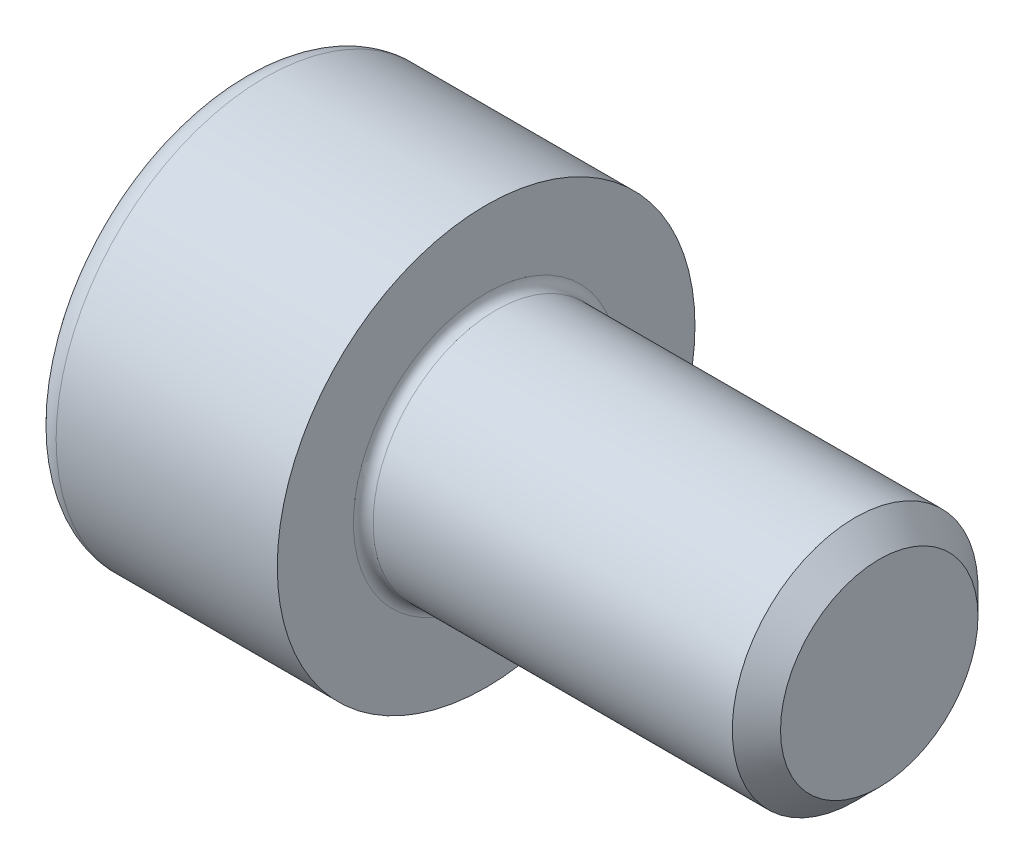
ISO-10303-21;
HEADER;
FILE_DESCRIPTION(('STEP AP214'),'2;1');
FILE_NAME('part.step','',(''),(''),'','','');
FILE_SCHEMA(('AUTOMOTIVE_DESIGN { 1 0 10303 214 1 1 1 1 }'));
ENDSEC;
DATA;
#1=APPLICATION_CONTEXT('core data for automotive mechanical design processes');
#2=APPLICATION_PROTOCOL_DEFINITION('international standard','automotive_design',2000,#1);
#3=PRODUCT_CONTEXT('',#1,'mechanical');
#4=PRODUCT('Part','Part','',(#3));
#5=PRODUCT_RELATED_PRODUCT_CATEGORY('part','',(#4));
#6=PRODUCT_DEFINITION_FORMATION('','',#4);
#7=PRODUCT_DEFINITION_CONTEXT('part definition',#1,'design');
#8=PRODUCT_DEFINITION('design','',#6,#7);
#9=PRODUCT_DEFINITION_SHAPE('','',#8);
#10=(LENGTH_UNIT() NAMED_UNIT(*) SI_UNIT(.MILLI.,.METRE.));
#11=(NAMED_UNIT(*) PLANE_ANGLE_UNIT() SI_UNIT($,.RADIAN.));
#12=(NAMED_UNIT(*) SI_UNIT($,.STERADIAN.) SOLID_ANGLE_UNIT());
#13=UNCERTAINTY_MEASURE_WITH_UNIT(LENGTH_MEASURE(1.E-05),#10,'distance_accuracy_value','');
#14=(GEOMETRIC_REPRESENTATION_CONTEXT(3) GLOBAL_UNCERTAINTY_ASSIGNED_CONTEXT((#13)) GLOBAL_UNIT_ASSIGNED_CONTEXT((#10,
#11,#12)) REPRESENTATION_CONTEXT('',''));
#15=CARTESIAN_POINT('',(0.,0.,0.));
#16=DIRECTION('',(0.,0.,1.));
#17=DIRECTION('',(1.,0.,0.));
#18=AXIS2_PLACEMENT_3D('',#15,#16,#17);
#19=CARTESIAN_POINT('',(8.,1.25,0.));
#20=DIRECTION('',(1.,0.,0.));
#21=DIRECTION('',(0.,1.,0.));
#22=AXIS2_PLACEMENT_3D('',#19,#20,#21);
#23=PLANE('',#22);
#24=CARTESIAN_POINT('',(7.99999999992451,0.,0.));
#25=DIRECTION('',(-1.,0.,0.));
#26=DIRECTION('',(0.,0.,1.));
#27=AXIS2_PLACEMENT_3D('',#24,#25,#26);
#28=CIRCLE('',#27,2.00924000000668);
#29=CARTESIAN_POINT('',(7.99999999992451,2.00924000000668,0.));
#30=VERTEX_POINT('',#29);
#31=EDGE_CURVE('E19',#30,#30,#28,.T.);
#32=ORIENTED_EDGE('',*,*,#31,.F.);
#33=EDGE_LOOP('',(#32));
#34=FACE_BOUND('',#33,.T.);
#35=ADVANCED_FACE('F16',(#34),#23,.T.);
#36=CARTESIAN_POINT('',(7.50923999999031,0.,0.));
#37=DIRECTION('',(-1.,0.,0.));
#38=DIRECTION('',(0.,0.,1.));
#39=AXIS2_PLACEMENT_3D('',#36,#37,#38);
#40=CONICAL_SURFACE('',#39,2.49999999999773,0.785398163455362);
#41=CARTESIAN_POINT('',(7.50924,0.,0.));
#42=DIRECTION('',(1.,0.,0.));
#43=DIRECTION('',(0.,1.,0.));
#44=AXIS2_PLACEMENT_3D('',#41,#42,#43);
#45=CIRCLE('',#44,2.5);
#46=CARTESIAN_POINT('',(7.50923999999516,2.49999999999886,0.));
#47=VERTEX_POINT('',#46);
#48=EDGE_CURVE('E35',#47,#47,#45,.F.);
#49=ORIENTED_EDGE('',*,*,#48,.F.);
#50=EDGE_LOOP('',(#49));
#51=FACE_BOUND('',#50,.T.);
#52=ORIENTED_EDGE('',*,*,#31,.T.);
#53=EDGE_LOOP('',(#52));
#54=FACE_BOUND('',#53,.T.);
#55=ADVANCED_FACE('F183',(#51,#54),#40,.T.);
#56=CARTESIAN_POINT('',(-2.50799999992068,0.,0.));
#57=DIRECTION('',(-1.,0.,0.));
#58=DIRECTION('',(0.,0.,1.));
#59=AXIS2_PLACEMENT_3D('',#56,#57,#58);
#60=CONICAL_SURFACE('',#59,2.32325748316953,1.04719755119795);
#61=CARTESIAN_POINT('',(-1.16666666662013,0.,0.));
#62=VERTEX_POINT('',#61);
#63=VERTEX_LOOP('',#62);
#64=FACE_BOUND('',#63,.T.);
#65=CARTESIAN_POINT('',(-2.4999999999532,2.0000000000117,-1.1547005383725));
#66=CARTESIAN_POINT('',(-2.47069554507963,1.91211211244848,-1.20544263391563));
#67=CARTESIAN_POINT('',(-2.44404467705295,1.82346557789014,-1.25662273450561));
#68=CARTESIAN_POINT('',(-2.39752638735245,1.64463765332491,-1.35986908489197));
#69=CARTESIAN_POINT('',(-2.37767542028997,1.55445308692619,-1.41193716857902));
#70=CARTESIAN_POINT('',(-2.34677595889734,1.37520156625159,-1.51542808229315));
#71=CARTESIAN_POINT('',(-2.33552178754783,1.28616218439386,-1.56683499337719));
#72=CARTESIAN_POINT('',(-2.3220891680807,1.10766467954793,-1.66989057584967));
#73=CARTESIAN_POINT('',(-2.31989959392411,1.01820720490444,-1.72153887291611));
#74=CARTESIAN_POINT('',(-2.32446629010413,0.851065510298021,-1.81803817528993));
#75=CARTESIAN_POINT('',(-2.33010128516551,0.773356209362159,-1.86290366110379));
#76=CARTESIAN_POINT('',(-2.34795730066752,0.61844385823774,-1.95234234872627));
#77=CARTESIAN_POINT('',(-2.36018441471823,0.541241343449726,-1.99691524142125));
#78=CARTESIAN_POINT('',(-2.39074983328857,0.386009858272597,-2.08653818117497));
#79=CARTESIAN_POINT('',(-2.40921764216901,0.308000524611783,-2.13157689096334));
#80=CARTESIAN_POINT('',(-2.45113176079118,0.153145029986886,-2.22098275247052));
#81=CARTESIAN_POINT('',(-2.47456822870469,0.0762968866753003,-2.26535104869819));
#82=CARTESIAN_POINT('',(-2.4999999999532,-1.16991321749545E-11,-2.30940107676526));
#83=B_SPLINE_CURVE_WITH_KNOTS('',3,(#65,#66,#67,#68,#69,#70,#71,#72,#73,#74,#75,#76,#77,#78,#79,
#80,#81,#82),.UNSPECIFIED.,.F.,.F.,(4,2,2,2,2,2,2,2,4),(0.,0.317016011557616,0.63479381702865,
0.944707606155182,1.25424088890079,1.52370778264095,1.79342419380956,2.06912162251021,
2.34427797354285),.UNSPECIFIED.);
#84=CARTESIAN_POINT('',(-2.49999999995125,2.,-1.154700538386));
#85=VERTEX_POINT('',#84);
#86=CARTESIAN_POINT('',(-2.4999999999532,0.,-2.30940107676525));
#87=VERTEX_POINT('',#86);
#88=EDGE_CURVE('E159',#85,#87,#83,.T.);
#89=ORIENTED_EDGE('',*,*,#88,.T.);
#90=CARTESIAN_POINT('',(-2.4999999999532,1.16998034000358E-11,-2.30940107676525));
#91=CARTESIAN_POINT('',(-2.47069554507963,-0.0878878875515161,-2.25865898122212));
#92=CARTESIAN_POINT('',(-2.44404467705295,-0.176534422109856,-2.20747888063214));
#93=CARTESIAN_POINT('',(-2.39752638735245,-0.355362346675091,-2.10423253024578));
#94=CARTESIAN_POINT('',(-2.37767542028997,-0.445546913073804,-2.05216444655873));
#95=CARTESIAN_POINT('',(-2.34677595889734,-0.624798433748409,-1.9486735328446));
#96=CARTESIAN_POINT('',(-2.33552178754783,-0.713837815606133,-1.89726662176056));
#97=CARTESIAN_POINT('',(-2.3220891680807,-0.892335320452072,-1.79421103928809));
#98=CARTESIAN_POINT('',(-2.31989959392411,-0.981792795095561,-1.74256274222164));
#99=CARTESIAN_POINT('',(-2.32446629010413,-1.14893448970198,-1.64606343984782));
#100=CARTESIAN_POINT('',(-2.33010128516551,-1.22664379063784,-1.60119795403396));
#101=CARTESIAN_POINT('',(-2.34795730066752,-1.38155614176226,-1.51175926641148));
#102=CARTESIAN_POINT('',(-2.36018441471823,-1.45875865655027,-1.4671863737165));
#103=CARTESIAN_POINT('',(-2.39074983328857,-1.6139901417274,-1.37756343396278));
#104=CARTESIAN_POINT('',(-2.40921764216901,-1.69199947538822,-1.33252472417441));
#105=CARTESIAN_POINT('',(-2.45113176079118,-1.84685497001311,-1.24311886266723));
#106=CARTESIAN_POINT('',(-2.47456822870469,-1.9237031133247,-1.19875056643956));
#107=CARTESIAN_POINT('',(-2.4999999999532,-2.0000000000117,-1.15470053837249));
#108=B_SPLINE_CURVE_WITH_KNOTS('',3,(#90,#91,#92,#93,#94,#95,#96,#97,#98,#99,#100,#101,#102,
#103,#104,#105,#106,#107),.UNSPECIFIED.,.F.,.F.,(4,2,2,2,2,2,2,2,4),(0.,0.317016011557615,
0.634793817028649,0.944707606155182,1.25424088890079,1.52370778264095,1.79342419380956,
2.06912162251021,2.34427797354285),.UNSPECIFIED.);
#109=CARTESIAN_POINT('',(-2.4999999999532,-2.00000000000585,-1.15470053838263));
#110=VERTEX_POINT('',#109);
#111=EDGE_CURVE('E168',#87,#110,#108,.T.);
#112=ORIENTED_EDGE('',*,*,#111,.T.);
#113=CARTESIAN_POINT('',(-2.4999999999532,-2.,-1.15470053839276));
#114=CARTESIAN_POINT('',(-2.47069554507963,-2.,-1.0532163473065));
#115=CARTESIAN_POINT('',(-2.44404467705295,-2.,-0.950856146126528));
#116=CARTESIAN_POINT('',(-2.39752638735245,-2.,-0.744363445353806));
#117=CARTESIAN_POINT('',(-2.37767542028997,-2.,-0.640227277979713));
#118=CARTESIAN_POINT('',(-2.34677595889734,-2.,-0.433245450551447));
#119=CARTESIAN_POINT('',(-2.33552178754783,-2.,-0.330431628383378));
#120=CARTESIAN_POINT('',(-2.3220891680807,-2.,-0.124320463438419));
#121=CARTESIAN_POINT('',(-2.31989959392411,-2.,-0.0210238693055342));
#122=CARTESIAN_POINT('',(-2.32446629010413,-2.,0.171974735442115));
#123=CARTESIAN_POINT('',(-2.33010128516551,-2.,0.26170570706983));
#124=CARTESIAN_POINT('',(-2.34795730066752,-2.,0.440583082314792));
#125=CARTESIAN_POINT('',(-2.36018441471823,-2.,0.529728867704743));
#126=CARTESIAN_POINT('',(-2.39074983328857,-2.,0.708974747212184));
#127=CARTESIAN_POINT('',(-2.40921764216901,-2.,0.799052166788933));
#128=CARTESIAN_POINT('',(-2.45113176079118,-2.,0.977863889803287));
#129=CARTESIAN_POINT('',(-2.47456822870469,-2.,1.06660048225862));
#130=CARTESIAN_POINT('',(-2.4999999999532,-2.,1.15470053839276));
#131=B_SPLINE_CURVE_WITH_KNOTS('',3,(#113,#114,#115,#116,#117,#118,#119,#120,#121,#122,#123,
#124,#125,#126,#127,#128,#129,#130),.UNSPECIFIED.,.F.,.F.,(4,2,2,2,2,2,2,2,4),(0.,
0.317016011557615,0.634793817028649,0.944707606155182,1.25424088890079,1.52370778264095,
1.79342419380956,2.06912162251021,2.34427797354285),.UNSPECIFIED.);
#132=CARTESIAN_POINT('',(-2.4999999999532,-2.00000000000585,1.15470053838263));
#133=VERTEX_POINT('',#132);
#134=EDGE_CURVE('E198',#110,#133,#131,.T.);
#135=ORIENTED_EDGE('',*,*,#134,.T.);
#136=CARTESIAN_POINT('',(-2.4999999999532,-2.0000000000117,1.1547005383725));
#137=CARTESIAN_POINT('',(-2.47069554507963,-1.91211211244848,1.20544263391563));
#138=CARTESIAN_POINT('',(-2.44404467705295,-1.82346557789014,1.25662273450561));
#139=CARTESIAN_POINT('',(-2.39752638735245,-1.64463765332491,1.35986908489197));
#140=CARTESIAN_POINT('',(-2.37767542028997,-1.55445308692619,1.41193716857902));
#141=CARTESIAN_POINT('',(-2.34677595889734,-1.37520156625159,1.51542808229315));
#142=CARTESIAN_POINT('',(-2.33552178754783,-1.28616218439387,1.56683499337719));
#143=CARTESIAN_POINT('',(-2.3220891680807,-1.10766467954793,1.66989057584966));
#144=CARTESIAN_POINT('',(-2.31989959392411,-1.01820720490444,1.72153887291611));
#145=CARTESIAN_POINT('',(-2.32446629010413,-0.851065510298022,1.81803817528993));
#146=CARTESIAN_POINT('',(-2.33010128516551,-0.773356209362159,1.86290366110379));
#147=CARTESIAN_POINT('',(-2.34795730066752,-0.61844385823774,1.95234234872627));
#148=CARTESIAN_POINT('',(-2.36018441471823,-0.541241343449726,1.99691524142125));
#149=CARTESIAN_POINT('',(-2.39074983328857,-0.386009858272597,2.08653818117497));
#150=CARTESIAN_POINT('',(-2.40921764216901,-0.308000524611784,2.13157689096334));
#151=CARTESIAN_POINT('',(-2.45113176079118,-0.153145029986886,2.22098275247052));
#152=CARTESIAN_POINT('',(-2.47456822870469,-0.0762968866753002,2.26535104869819));
#153=CARTESIAN_POINT('',(-2.4999999999532,1.16991482687033E-11,2.30940107676526));
#154=B_SPLINE_CURVE_WITH_KNOTS('',3,(#136,#137,#138,#139,#140,#141,#142,#143,#144,#145,#146,
#147,#148,#149,#150,#151,#152,#153),.UNSPECIFIED.,.F.,.F.,(4,2,2,2,2,2,2,2,4),(0.,
0.317016011557616,0.63479381702865,0.944707606155183,1.25424088890079,1.52370778264095,
1.79342419380956,2.06912162251021,2.34427797354285),.UNSPECIFIED.);
#155=CARTESIAN_POINT('',(-2.4999999999532,0.,2.30940107676525));
#156=VERTEX_POINT('',#155);
#157=EDGE_CURVE('E204',#133,#156,#154,.T.);
#158=ORIENTED_EDGE('',*,*,#157,.T.);
#159=CARTESIAN_POINT('',(-2.4999999999532,-1.16994176667835E-11,2.30940107676525));
#160=CARTESIAN_POINT('',(-2.47069554507963,0.0878878875515165,2.25865898122212));
#161=CARTESIAN_POINT('',(-2.44404467705295,0.176534422109856,2.20747888063214));
#162=CARTESIAN_POINT('',(-2.39752638735245,0.355362346675092,2.10423253024578));
#163=CARTESIAN_POINT('',(-2.37767542028997,0.445546913073805,2.05216444655873));
#164=CARTESIAN_POINT('',(-2.34677595889734,0.62479843374841,1.9486735328446));
#165=CARTESIAN_POINT('',(-2.33552178754783,0.713837815606134,1.89726662176056));
#166=CARTESIAN_POINT('',(-2.3220891680807,0.892335320452072,1.79421103928809));
#167=CARTESIAN_POINT('',(-2.31989959392411,0.981792795095561,1.74256274222164));
#168=CARTESIAN_POINT('',(-2.32446629010413,1.14893448970198,1.64606343984782));
#169=CARTESIAN_POINT('',(-2.33010128516551,1.22664379063784,1.60119795403396));
#170=CARTESIAN_POINT('',(-2.34795730066752,1.38155614176226,1.51175926641148));
#171=CARTESIAN_POINT('',(-2.36018441471823,1.45875865655027,1.4671863737165));
#172=CARTESIAN_POINT('',(-2.39074983328857,1.6139901417274,1.37756343396278));
#173=CARTESIAN_POINT('',(-2.40921764216901,1.69199947538822,1.33252472417441));
#174=CARTESIAN_POINT('',(-2.45113176079118,1.84685497001311,1.24311886266723));
#175=CARTESIAN_POINT('',(-2.47456822870469,1.9237031133247,1.19875056643956));
#176=CARTESIAN_POINT('',(-2.4999999999532,2.0000000000117,1.15470053837249));
#177=B_SPLINE_CURVE_WITH_KNOTS('',3,(#159,#160,#161,#162,#163,#164,#165,#166,#167,#168,#169,
#170,#171,#172,#173,#174,#175,#176),.UNSPECIFIED.,.F.,.F.,(4,2,2,2,2,2,2,2,4),(0.,
0.317016011557615,0.634793817028649,0.944707606155182,1.25424088890079,1.52370778264095,
1.79342419380956,2.06912162251021,2.34427797354285),.UNSPECIFIED.);
#178=CARTESIAN_POINT('',(-2.4999999999532,2.00000000000585,1.15470053838263));
#179=VERTEX_POINT('',#178);
#180=EDGE_CURVE('E113',#156,#179,#177,.T.);
#181=ORIENTED_EDGE('',*,*,#180,.T.);
#182=CARTESIAN_POINT('',(-2.4999999999532,2.,1.15470053839276));
#183=CARTESIAN_POINT('',(-2.47069554507963,2.,1.0532163473065));
#184=CARTESIAN_POINT('',(-2.44404467705295,2.,0.950856146126528));
#185=CARTESIAN_POINT('',(-2.39752638735245,2.,0.744363445353806));
#186=CARTESIAN_POINT('',(-2.37767542028997,2.,0.640227277979713));
#187=CARTESIAN_POINT('',(-2.34677595889734,2.,0.433245450551447));
#188=CARTESIAN_POINT('',(-2.33552178754783,2.,0.330431628383377));
#189=CARTESIAN_POINT('',(-2.3220891680807,2.,0.124320463438419));
#190=CARTESIAN_POINT('',(-2.31989959392411,2.,0.0210238693055337));
#191=CARTESIAN_POINT('',(-2.32446629010413,2.,-0.171974735442115));
#192=CARTESIAN_POINT('',(-2.33010128516551,2.,-0.261705707069831));
#193=CARTESIAN_POINT('',(-2.34795730066752,2.,-0.440583082314792));
#194=CARTESIAN_POINT('',(-2.36018441471823,2.,-0.529728867704744));
#195=CARTESIAN_POINT('',(-2.39074983328857,2.,-0.708974747212185));
#196=CARTESIAN_POINT('',(-2.40921764216901,2.,-0.799052166788933));
#197=CARTESIAN_POINT('',(-2.45113176079118,2.,-0.977863889803288));
#198=CARTESIAN_POINT('',(-2.47456822870469,2.,-1.06660048225862));
#199=CARTESIAN_POINT('',(-2.4999999999532,2.,-1.15470053839276));
#200=B_SPLINE_CURVE_WITH_KNOTS('',3,(#182,#183,#184,#185,#186,#187,#188,#189,#190,#191,#192,
#193,#194,#195,#196,#197,#198,#199),.UNSPECIFIED.,.F.,.F.,(4,2,2,2,2,2,2,2,4),(0.,
0.317016011557615,0.63479381702865,0.944707606155182,1.25424088890079,1.52370778264095,
1.79342419380956,2.06912162251021,2.34427797354285),.UNSPECIFIED.);
#201=EDGE_CURVE('E64',#179,#85,#200,.T.);
#202=ORIENTED_EDGE('',*,*,#201,.T.);
#203=EDGE_LOOP('',(#89,#112,#135,#158,#181,#202));
#204=FACE_BOUND('',#203,.T.);
#205=ADVANCED_FACE('F178',(#64,#204),#60,.F.);
#206=CARTESIAN_POINT('',(5.,0.,0.));
#207=DIRECTION('',(1.,0.,0.));
#208=DIRECTION('',(0.,1.,0.));
#209=AXIS2_PLACEMENT_3D('',#206,#207,#208);
#210=CYLINDRICAL_SURFACE('',#209,2.5);
#211=CARTESIAN_POINT('',(0.200000000000002,0.,0.));
#212=DIRECTION('',(1.,0.,0.));
#213=DIRECTION('',(0.,0.,-1.));
#214=AXIS2_PLACEMENT_3D('',#211,#212,#213);
#215=CIRCLE('',#214,2.5);
#216=CARTESIAN_POINT('',(0.200000000000002,2.5,0.));
#217=VERTEX_POINT('',#216);
#218=CARTESIAN_POINT('',(0.200000000000002,-2.5,0.));
#219=VERTEX_POINT('',#218);
#220=EDGE_CURVE('E129',#217,#219,#215,.T.);
#221=ORIENTED_EDGE('',*,*,#220,.T.);
#222=CARTESIAN_POINT('',(0.200000000000002,0.,0.));
#223=DIRECTION('',(1.,0.,0.));
#224=DIRECTION('',(0.,0.,-1.));
#225=AXIS2_PLACEMENT_3D('',#222,#223,#224);
#226=CIRCLE('',#225,2.5);
#227=EDGE_CURVE('E72',#219,#217,#226,.T.);
#228=ORIENTED_EDGE('',*,*,#227,.T.);
#229=EDGE_LOOP('',(#221,#228));
#230=FACE_BOUND('',#229,.T.);
#231=ORIENTED_EDGE('',*,*,#48,.T.);
#232=EDGE_LOOP('',(#231));
#233=FACE_BOUND('',#232,.T.);
#234=ADVANCED_FACE('F182',(#230,#233),#210,.T.);
#235=CARTESIAN_POINT('',(-5.,2.,1.15470053837925));
#236=DIRECTION('',(0.,1.,0.));
#237=DIRECTION('',(0.,0.,1.));
#238=AXIS2_PLACEMENT_3D('',#235,#236,#237);
#239=PLANE('',#238);
#240=DIRECTION('',(1.,0.,0.));
#241=VECTOR('',#240,1.);
#242=CARTESIAN_POINT('',(-5.,2.,1.15470053837925));
#243=LINE('',#242,#241);
#244=CARTESIAN_POINT('',(-5.,2.,1.15470053837925));
#245=VERTEX_POINT('',#244);
#246=EDGE_CURVE('E108',#179,#245,#243,.F.);
#247=ORIENTED_EDGE('',*,*,#246,.T.);
#248=DIRECTION('',(0.,0.,1.));
#249=VECTOR('',#248,1.);
#250=CARTESIAN_POINT('',(-5.,2.,0.));
#251=LINE('',#250,#249);
#252=CARTESIAN_POINT('',(-5.,2.,-1.15470053837925));
#253=VERTEX_POINT('',#252);
#254=EDGE_CURVE('E111',#253,#245,#251,.T.);
#255=ORIENTED_EDGE('',*,*,#254,.F.);
#256=DIRECTION('',(1.,0.,0.));
#257=VECTOR('',#256,1.);
#258=CARTESIAN_POINT('',(-5.,2.,-1.15470053837925));
#259=LINE('',#258,#257);
#260=EDGE_CURVE('E167',#253,#85,#259,.T.);
#261=ORIENTED_EDGE('',*,*,#260,.T.);
#262=ORIENTED_EDGE('',*,*,#201,.F.);
#263=EDGE_LOOP('',(#247,#255,#261,#262));
#264=FACE_BOUND('',#263,.T.);
#265=ADVANCED_FACE('F109',(#264),#239,.F.);
#266=CARTESIAN_POINT('',(-5.,0.,2.3094010767585));
#267=DIRECTION('',(0.,0.5,0.866025403784439));
#268=DIRECTION('',(0.,-0.866025403784439,0.5));
#269=AXIS2_PLACEMENT_3D('',#266,#267,#268);
#270=PLANE('',#269);
#271=DIRECTION('',(1.,0.,0.));
#272=VECTOR('',#271,1.);
#273=CARTESIAN_POINT('',(-5.,0.,2.3094010767585));
#274=LINE('',#273,#272);
#275=CARTESIAN_POINT('',(-5.,0.,2.3094010767585));
#276=VERTEX_POINT('',#275);
#277=EDGE_CURVE('E103',#156,#276,#274,.F.);
#278=ORIENTED_EDGE('',*,*,#277,.T.);
#279=DIRECTION('',(0.,-0.866025403784439,0.499999999999999));
#280=VECTOR('',#279,1.);
#281=CARTESIAN_POINT('',(-5.,2.,1.15470053837925));
#282=LINE('',#281,#280);
#283=EDGE_CURVE('E116',#245,#276,#282,.T.);
#284=ORIENTED_EDGE('',*,*,#283,.F.);
#285=ORIENTED_EDGE('',*,*,#246,.F.);
#286=ORIENTED_EDGE('',*,*,#180,.F.);
#287=EDGE_LOOP('',(#278,#284,#285,#286));
#288=FACE_BOUND('',#287,.T.);
#289=ADVANCED_FACE('F117',(#288),#270,.F.);
#290=CARTESIAN_POINT('',(-5.,-2.,1.15470053837925));
#291=DIRECTION('',(0.,-0.5,0.866025403784439));
#292=DIRECTION('',(0.,-0.866025403784439,-0.5));
#293=AXIS2_PLACEMENT_3D('',#290,#291,#292);
#294=PLANE('',#293);
#295=DIRECTION('',(1.,0.,0.));
#296=VECTOR('',#295,1.);
#297=CARTESIAN_POINT('',(-5.,-2.,1.15470053837925));
#298=LINE('',#297,#296);
#299=CARTESIAN_POINT('',(-5.,-2.,1.15470053837925));
#300=VERTEX_POINT('',#299);
#301=EDGE_CURVE('E211',#133,#300,#298,.F.);
#302=ORIENTED_EDGE('',*,*,#301,.T.);
#303=DIRECTION('',(0.,-0.866025403784439,-0.499999999999999));
#304=VECTOR('',#303,1.);
#305=CARTESIAN_POINT('',(-5.,0.,2.3094010767585));
#306=LINE('',#305,#304);
#307=EDGE_CURVE('E120',#276,#300,#306,.T.);
#308=ORIENTED_EDGE('',*,*,#307,.F.);
#309=ORIENTED_EDGE('',*,*,#277,.F.);
#310=ORIENTED_EDGE('',*,*,#157,.F.);
#311=EDGE_LOOP('',(#302,#308,#309,#310));
#312=FACE_BOUND('',#311,.T.);
#313=ADVANCED_FACE('F212',(#312),#294,.F.);
#314=CARTESIAN_POINT('',(-5.,-2.,-1.15470053837925));
#315=DIRECTION('',(0.,-1.,0.));
#316=DIRECTION('',(0.,0.,-1.));
#317=AXIS2_PLACEMENT_3D('',#314,#315,#316);
#318=PLANE('',#317);
#319=DIRECTION('',(1.,0.,0.));
#320=VECTOR('',#319,1.);
#321=CARTESIAN_POINT('',(-5.,-2.,-1.15470053837925));
#322=LINE('',#321,#320);
#323=CARTESIAN_POINT('',(-5.,-2.,-1.15470053837925));
#324=VERTEX_POINT('',#323);
#325=EDGE_CURVE('E238',#110,#324,#322,.F.);
#326=ORIENTED_EDGE('',*,*,#325,.T.);
#327=DIRECTION('',(0.,0.,1.));
#328=VECTOR('',#327,1.);
#329=CARTESIAN_POINT('',(-5.,-2.,0.));
#330=LINE('',#329,#328);
#331=EDGE_CURVE('E143',#300,#324,#330,.F.);
#332=ORIENTED_EDGE('',*,*,#331,.F.);
#333=ORIENTED_EDGE('',*,*,#301,.F.);
#334=ORIENTED_EDGE('',*,*,#134,.F.);
#335=EDGE_LOOP('',(#326,#332,#333,#334));
#336=FACE_BOUND('',#335,.T.);
#337=ADVANCED_FACE('F215',(#336),#318,.F.);
#338=CARTESIAN_POINT('',(-5.,0.,-2.3094010767585));
#339=DIRECTION('',(0.,-0.5,-0.866025403784439));
#340=DIRECTION('',(0.,0.866025403784439,-0.5));
#341=AXIS2_PLACEMENT_3D('',#338,#339,#340);
#342=PLANE('',#341);
#343=DIRECTION('',(1.,0.,0.));
#344=VECTOR('',#343,1.);
#345=CARTESIAN_POINT('',(-5.,0.,-2.3094010767585));
#346=LINE('',#345,#344);
#347=CARTESIAN_POINT('',(-5.,0.,-2.3094010767585));
#348=VERTEX_POINT('',#347);
#349=EDGE_CURVE('E242',#87,#348,#346,.F.);
#350=ORIENTED_EDGE('',*,*,#349,.T.);
#351=DIRECTION('',(0.,0.866025403784439,-0.5));
#352=VECTOR('',#351,1.);
#353=CARTESIAN_POINT('',(-5.,-2.,-1.15470053837925));
#354=LINE('',#353,#352);
#355=EDGE_CURVE('E139',#324,#348,#354,.T.);
#356=ORIENTED_EDGE('',*,*,#355,.F.);
#357=ORIENTED_EDGE('',*,*,#325,.F.);
#358=ORIENTED_EDGE('',*,*,#111,.F.);
#359=EDGE_LOOP('',(#350,#356,#357,#358));
#360=FACE_BOUND('',#359,.T.);
#361=ADVANCED_FACE('F386',(#360),#342,.F.);
#362=CARTESIAN_POINT('',(-5.,2.,-1.15470053837925));
#363=DIRECTION('',(0.,0.5,-0.866025403784439));
#364=DIRECTION('',(0.,0.866025403784439,0.5));
#365=AXIS2_PLACEMENT_3D('',#362,#363,#364);
#366=PLANE('',#365);
#367=ORIENTED_EDGE('',*,*,#260,.F.);
#368=DIRECTION('',(0.,0.866025403784439,0.499999999999999));
#369=VECTOR('',#368,1.);
#370=CARTESIAN_POINT('',(-5.,0.,-2.3094010767585));
#371=LINE('',#370,#369);
#372=EDGE_CURVE('E127',#348,#253,#371,.T.);
#373=ORIENTED_EDGE('',*,*,#372,.F.);
#374=ORIENTED_EDGE('',*,*,#349,.F.);
#375=ORIENTED_EDGE('',*,*,#88,.F.);
#376=EDGE_LOOP('',(#367,#373,#374,#375));
#377=FACE_BOUND('',#376,.T.);
#378=ADVANCED_FACE('F175',(#377),#366,.F.);
#379=CARTESIAN_POINT('',(0.200000000000002,0.,0.));
#380=DIRECTION('',(1.,0.,0.));
#381=DIRECTION('',(0.,0.,-1.));
#382=AXIS2_PLACEMENT_3D('',#379,#380,#381);
#383=TOROIDAL_SURFACE('',#382,2.7,0.2);
#384=CARTESIAN_POINT('',(0.,0.,0.));
#385=DIRECTION('',(1.,0.,0.));
#386=DIRECTION('',(0.,-1.,0.));
#387=AXIS2_PLACEMENT_3D('',#384,#385,#386);
#388=CIRCLE('',#387,2.7);
#389=CARTESIAN_POINT('',(0.,2.7,0.));
#390=VERTEX_POINT('',#389);
#391=CARTESIAN_POINT('',(0.,-2.7,0.));
#392=VERTEX_POINT('',#391);
#393=EDGE_CURVE('E138',#390,#392,#388,.F.);
#394=ORIENTED_EDGE('',*,*,#393,.F.);
#395=CARTESIAN_POINT('',(0.,0.,0.));
#396=DIRECTION('',(1.,0.,0.));
#397=DIRECTION('',(0.,1.,0.));
#398=AXIS2_PLACEMENT_3D('',#395,#396,#397);
#399=CIRCLE('',#398,2.7);
#400=EDGE_CURVE('E274',#392,#390,#399,.F.);
#401=ORIENTED_EDGE('',*,*,#400,.F.);
#402=EDGE_LOOP('',(#394,#401));
#403=FACE_BOUND('',#402,.T.);
#404=ORIENTED_EDGE('',*,*,#220,.F.);
#405=ORIENTED_EDGE('',*,*,#227,.F.);
#406=EDGE_LOOP('',(#404,#405));
#407=FACE_BOUND('',#406,.T.);
#408=ADVANCED_FACE('F251',(#403,#407),#383,.F.);
#409=CARTESIAN_POINT('',(-5.,3.27970053837925,0.));
#410=DIRECTION('',(-1.,0.,0.));
#411=DIRECTION('',(0.,-1.,0.));
#412=AXIS2_PLACEMENT_3D('',#409,#410,#411);
#413=PLANE('',#412);
#414=ORIENTED_EDGE('',*,*,#355,.T.);
#415=ORIENTED_EDGE('',*,*,#372,.T.);
#416=ORIENTED_EDGE('',*,*,#254,.T.);
#417=ORIENTED_EDGE('',*,*,#283,.T.);
#418=ORIENTED_EDGE('',*,*,#307,.T.);
#419=ORIENTED_EDGE('',*,*,#331,.T.);
#420=EDGE_LOOP('',(#414,#415,#416,#417,#418,#419));
#421=FACE_BOUND('',#420,.T.);
#422=CARTESIAN_POINT('',(-5.,0.,0.));
#423=DIRECTION('',(1.,0.,0.));
#424=DIRECTION('',(0.,-1.,0.));
#425=AXIS2_PLACEMENT_3D('',#422,#423,#424);
#426=CIRCLE('',#425,3.75);
#427=CARTESIAN_POINT('',(-5.,-3.75,0.));
#428=VERTEX_POINT('',#427);
#429=CARTESIAN_POINT('',(-5.,3.75,0.));
#430=VERTEX_POINT('',#429);
#431=EDGE_CURVE('E158',#428,#430,#426,.T.);
#432=ORIENTED_EDGE('',*,*,#431,.F.);
#433=CARTESIAN_POINT('',(-5.,0.,0.));
#434=DIRECTION('',(1.,0.,0.));
#435=DIRECTION('',(0.,1.,0.));
#436=AXIS2_PLACEMENT_3D('',#433,#434,#435);
#437=CIRCLE('',#436,3.75);
#438=EDGE_CURVE('E286',#430,#428,#437,.T.);
#439=ORIENTED_EDGE('',*,*,#438,.F.);
#440=EDGE_LOOP('',(#432,#439));
#441=FACE_BOUND('',#440,.T.);
#442=ADVANCED_FACE('F124',(#421,#441),#413,.T.);
#443=CARTESIAN_POINT('',(0.,3.375,0.));
#444=DIRECTION('',(1.,0.,0.));
#445=DIRECTION('',(0.,1.,0.));
#446=AXIS2_PLACEMENT_3D('',#443,#444,#445);
#447=PLANE('',#446);
#448=ORIENTED_EDGE('',*,*,#393,.T.);
#449=ORIENTED_EDGE('',*,*,#400,.T.);
#450=EDGE_LOOP('',(#448,#449));
#451=FACE_BOUND('',#450,.T.);
#452=CARTESIAN_POINT('',(0.,0.,0.));
#453=DIRECTION('',(1.,0.,0.));
#454=DIRECTION('',(0.,1.,0.));
#455=AXIS2_PLACEMENT_3D('',#452,#453,#454);
#456=CIRCLE('',#455,4.25);
#457=CARTESIAN_POINT('',(0.,4.25,0.));
#458=VERTEX_POINT('',#457);
#459=EDGE_CURVE('E155',#458,#458,#456,.F.);
#460=ORIENTED_EDGE('',*,*,#459,.F.);
#461=EDGE_LOOP('',(#460));
#462=FACE_BOUND('',#461,.T.);
#463=ADVANCED_FACE('F288',(#451,#462),#447,.T.);
#464=CARTESIAN_POINT('',(-4.5,0.,0.));
#465=DIRECTION('',(1.,0.,0.));
#466=DIRECTION('',(0.,0.,-1.));
#467=AXIS2_PLACEMENT_3D('',#464,#465,#466);
#468=TOROIDAL_SURFACE('',#467,3.75,0.5);
#469=ORIENTED_EDGE('',*,*,#438,.T.);
#470=ORIENTED_EDGE('',*,*,#431,.T.);
#471=EDGE_LOOP('',(#469,#470));
#472=FACE_BOUND('',#471,.T.);
#473=CARTESIAN_POINT('',(-4.5,0.,0.));
#474=DIRECTION('',(1.,0.,0.));
#475=DIRECTION('',(0.,1.,0.));
#476=AXIS2_PLACEMENT_3D('',#473,#474,#475);
#477=CIRCLE('',#476,4.25);
#478=CARTESIAN_POINT('',(-4.5,-4.25,0.));
#479=VERTEX_POINT('',#478);
#480=CARTESIAN_POINT('',(-4.5,4.25,0.));
#481=VERTEX_POINT('',#480);
#482=EDGE_CURVE('E11',#479,#481,#477,.T.);
#483=ORIENTED_EDGE('',*,*,#482,.F.);
#484=CARTESIAN_POINT('',(-4.5,0.,0.));
#485=DIRECTION('',(1.,0.,0.));
#486=DIRECTION('',(0.,1.,0.));
#487=AXIS2_PLACEMENT_3D('',#484,#485,#486);
#488=CIRCLE('',#487,4.25);
#489=EDGE_CURVE('E24',#481,#479,#488,.T.);
#490=ORIENTED_EDGE('',*,*,#489,.F.);
#491=EDGE_LOOP('',(#483,#490));
#492=FACE_BOUND('',#491,.T.);
#493=ADVANCED_FACE('F304',(#472,#492),#468,.T.);
#494=CARTESIAN_POINT('',(-2.5,0.,0.));
#495=DIRECTION('',(1.,0.,0.));
#496=DIRECTION('',(0.,1.,0.));
#497=AXIS2_PLACEMENT_3D('',#494,#495,#496);
#498=CYLINDRICAL_SURFACE('',#497,4.25);
#499=ORIENTED_EDGE('',*,*,#489,.T.);
#500=ORIENTED_EDGE('',*,*,#482,.T.);
#501=EDGE_LOOP('',(#499,#500));
#502=FACE_BOUND('',#501,.T.);
#503=ORIENTED_EDGE('',*,*,#459,.T.);
#504=EDGE_LOOP('',(#503));
#505=FACE_BOUND('',#504,.T.);
#506=ADVANCED_FACE('F356',(#502,#505),#498,.T.);
#507=CLOSED_SHELL('',(#35,#55,#205,#234,#265,#289,#313,#337,#361,#378,#408,#442,#463,#493,#506));
#508=MANIFOLD_SOLID_BREP('B1',#507);
#509=ADVANCED_BREP_SHAPE_REPRESENTATION('',(#18,#508),#14);
#510=SHAPE_DEFINITION_REPRESENTATION(#9,#509);
ENDSEC;
END-ISO-10303-21;
